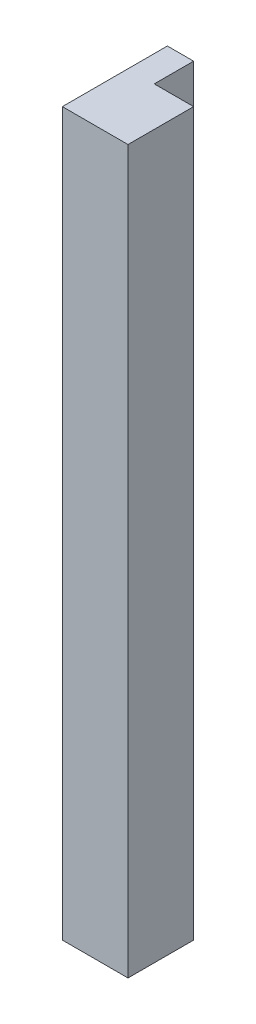
ISO-10303-21;
HEADER;
FILE_DESCRIPTION(('STEP AP214'),'2;1');
FILE_NAME('part.step','',(''),(''),'','','');
FILE_SCHEMA(('AUTOMOTIVE_DESIGN { 1 0 10303 214 1 1 1 1 }'));
ENDSEC;
DATA;
#1=APPLICATION_CONTEXT('core data for automotive mechanical design processes');
#2=APPLICATION_PROTOCOL_DEFINITION('international standard','automotive_design',2000,#1);
#3=PRODUCT_CONTEXT('',#1,'mechanical');
#4=PRODUCT('Part','Part','',(#3));
#5=PRODUCT_RELATED_PRODUCT_CATEGORY('part','',(#4));
#6=PRODUCT_DEFINITION_FORMATION('','',#4);
#7=PRODUCT_DEFINITION_CONTEXT('part definition',#1,'design');
#8=PRODUCT_DEFINITION('design','',#6,#7);
#9=PRODUCT_DEFINITION_SHAPE('','',#8);
#10=(LENGTH_UNIT() NAMED_UNIT(*) SI_UNIT(.MILLI.,.METRE.));
#11=(NAMED_UNIT(*) PLANE_ANGLE_UNIT() SI_UNIT($,.RADIAN.));
#12=(NAMED_UNIT(*) SI_UNIT($,.STERADIAN.) SOLID_ANGLE_UNIT());
#13=UNCERTAINTY_MEASURE_WITH_UNIT(LENGTH_MEASURE(1.E-05),#10,'distance_accuracy_value','');
#14=(GEOMETRIC_REPRESENTATION_CONTEXT(3) GLOBAL_UNCERTAINTY_ASSIGNED_CONTEXT((#13)) GLOBAL_UNIT_ASSIGNED_CONTEXT((#10,
#11,#12)) REPRESENTATION_CONTEXT('',''));
#15=CARTESIAN_POINT('',(0.,0.,0.));
#16=DIRECTION('',(0.,0.,1.));
#17=DIRECTION('',(1.,0.,0.));
#18=AXIS2_PLACEMENT_3D('',#15,#16,#17);
#19=CARTESIAN_POINT('',(-2.5,55.,4.));
#20=DIRECTION('',(1.,0.,0.));
#21=DIRECTION('',(0.,0.,-1.));
#22=AXIS2_PLACEMENT_3D('',#19,#20,#21);
#23=PLANE('',#22);
#24=DIRECTION('',(0.,0.,1.));
#25=VECTOR('',#24,1.);
#26=CARTESIAN_POINT('',(-2.5,0.,4.));
#27=LINE('',#26,#25);
#28=CARTESIAN_POINT('',(-2.5,0.,-4.));
#29=VERTEX_POINT('',#28);
#30=CARTESIAN_POINT('',(-2.5,0.,4.));
#31=VERTEX_POINT('',#30);
#32=EDGE_CURVE('E120',#29,#31,#27,.T.);
#33=ORIENTED_EDGE('',*,*,#32,.T.);
#34=DIRECTION('',(0.,-1.,0.));
#35=VECTOR('',#34,1.);
#36=CARTESIAN_POINT('',(-2.5,55.,4.));
#37=LINE('',#36,#35);
#38=CARTESIAN_POINT('',(-2.5,55.,4.));
#39=VERTEX_POINT('',#38);
#40=EDGE_CURVE('E11',#39,#31,#37,.T.);
#41=ORIENTED_EDGE('',*,*,#40,.F.);
#42=DIRECTION('',(0.,0.,1.));
#43=VECTOR('',#42,1.);
#44=CARTESIAN_POINT('',(-2.5,55.,4.));
#45=LINE('',#44,#43);
#46=CARTESIAN_POINT('',(-2.5,55.,-4.));
#47=VERTEX_POINT('',#46);
#48=EDGE_CURVE('E116',#47,#39,#45,.T.);
#49=ORIENTED_EDGE('',*,*,#48,.F.);
#50=DIRECTION('',(0.,-1.,0.));
#51=VECTOR('',#50,1.);
#52=CARTESIAN_POINT('',(-2.5,55.,-4.));
#53=LINE('',#52,#51);
#54=EDGE_CURVE('E114',#47,#29,#53,.T.);
#55=ORIENTED_EDGE('',*,*,#54,.T.);
#56=EDGE_LOOP('',(#33,#41,#49,#55));
#57=FACE_BOUND('',#56,.T.);
#58=ADVANCED_FACE('F34',(#57),#23,.F.);
#59=CARTESIAN_POINT('',(2.5,55.,4.));
#60=DIRECTION('',(0.,0.,-1.));
#61=DIRECTION('',(-1.,0.,0.));
#62=AXIS2_PLACEMENT_3D('',#59,#60,#61);
#63=PLANE('',#62);
#64=DIRECTION('',(1.,0.,0.));
#65=VECTOR('',#64,1.);
#66=CARTESIAN_POINT('',(2.5,0.,4.));
#67=LINE('',#66,#65);
#68=CARTESIAN_POINT('',(2.5,0.,4.));
#69=VERTEX_POINT('',#68);
#70=EDGE_CURVE('E123',#31,#69,#67,.T.);
#71=ORIENTED_EDGE('',*,*,#70,.T.);
#72=DIRECTION('',(0.,-1.,0.));
#73=VECTOR('',#72,1.);
#74=CARTESIAN_POINT('',(2.5,55.,4.));
#75=LINE('',#74,#73);
#76=CARTESIAN_POINT('',(2.5,55.,4.));
#77=VERTEX_POINT('',#76);
#78=EDGE_CURVE('E41',#77,#69,#75,.T.);
#79=ORIENTED_EDGE('',*,*,#78,.F.);
#80=DIRECTION('',(1.,0.,0.));
#81=VECTOR('',#80,1.);
#82=CARTESIAN_POINT('',(2.5,55.,4.));
#83=LINE('',#82,#81);
#84=EDGE_CURVE('E80',#39,#77,#83,.T.);
#85=ORIENTED_EDGE('',*,*,#84,.F.);
#86=ORIENTED_EDGE('',*,*,#40,.T.);
#87=EDGE_LOOP('',(#71,#79,#85,#86));
#88=FACE_BOUND('',#87,.T.);
#89=ADVANCED_FACE('F141',(#88),#63,.F.);
#90=CARTESIAN_POINT('',(2.5,55.,4.));
#91=DIRECTION('',(-1.,0.,0.));
#92=DIRECTION('',(0.,0.,1.));
#93=AXIS2_PLACEMENT_3D('',#90,#91,#92);
#94=PLANE('',#93);
#95=DIRECTION('',(0.,0.,-1.));
#96=VECTOR('',#95,1.);
#97=CARTESIAN_POINT('',(2.5,0.,4.));
#98=LINE('',#97,#96);
#99=CARTESIAN_POINT('',(2.5,0.,-1.));
#100=VERTEX_POINT('',#99);
#101=EDGE_CURVE('E110',#69,#100,#98,.T.);
#102=ORIENTED_EDGE('',*,*,#101,.T.);
#103=DIRECTION('',(0.,-1.,0.));
#104=VECTOR('',#103,1.);
#105=CARTESIAN_POINT('',(2.5,55.,-1.));
#106=LINE('',#105,#104);
#107=CARTESIAN_POINT('',(2.5,55.,-1.));
#108=VERTEX_POINT('',#107);
#109=EDGE_CURVE('E48',#108,#100,#106,.T.);
#110=ORIENTED_EDGE('',*,*,#109,.F.);
#111=DIRECTION('',(0.,0.,-1.));
#112=VECTOR('',#111,1.);
#113=CARTESIAN_POINT('',(2.5,55.,4.));
#114=LINE('',#113,#112);
#115=EDGE_CURVE('E108',#77,#108,#114,.T.);
#116=ORIENTED_EDGE('',*,*,#115,.F.);
#117=ORIENTED_EDGE('',*,*,#78,.T.);
#118=EDGE_LOOP('',(#102,#110,#116,#117));
#119=FACE_BOUND('',#118,.T.);
#120=ADVANCED_FACE('F106',(#119),#94,.F.);
#121=CARTESIAN_POINT('',(2.5,55.,-4.));
#122=DIRECTION('',(0.,0.,1.));
#123=DIRECTION('',(1.,0.,0.));
#124=AXIS2_PLACEMENT_3D('',#121,#122,#123);
#125=PLANE('',#124);
#126=DIRECTION('',(-1.,0.,0.));
#127=VECTOR('',#126,1.);
#128=CARTESIAN_POINT('',(2.5,55.,-4.));
#129=LINE('',#128,#127);
#130=CARTESIAN_POINT('',(-0.5,55.,-4.));
#131=VERTEX_POINT('',#130);
#132=EDGE_CURVE('E57',#131,#47,#129,.T.);
#133=ORIENTED_EDGE('',*,*,#132,.F.);
#134=DIRECTION('',(0.,-1.,0.));
#135=VECTOR('',#134,1.);
#136=CARTESIAN_POINT('',(-0.5,55.,-4.));
#137=LINE('',#136,#135);
#138=CARTESIAN_POINT('',(-0.5,0.,-4.));
#139=VERTEX_POINT('',#138);
#140=EDGE_CURVE('E124',#131,#139,#137,.T.);
#141=ORIENTED_EDGE('',*,*,#140,.T.);
#142=DIRECTION('',(-1.,0.,0.));
#143=VECTOR('',#142,1.);
#144=CARTESIAN_POINT('',(2.5,0.,-4.));
#145=LINE('',#144,#143);
#146=EDGE_CURVE('E75',#139,#29,#145,.T.);
#147=ORIENTED_EDGE('',*,*,#146,.T.);
#148=ORIENTED_EDGE('',*,*,#54,.F.);
#149=EDGE_LOOP('',(#133,#141,#147,#148));
#150=FACE_BOUND('',#149,.T.);
#151=ADVANCED_FACE('F147',(#150),#125,.F.);
#152=CARTESIAN_POINT('',(0.,55.,0.));
#153=DIRECTION('',(0.,1.,0.));
#154=DIRECTION('',(0.,0.,1.));
#155=AXIS2_PLACEMENT_3D('',#152,#153,#154);
#156=PLANE('',#155);
#157=DIRECTION('',(0.,0.,-1.));
#158=VECTOR('',#157,1.);
#159=CARTESIAN_POINT('',(-0.5,55.,-4.));
#160=LINE('',#159,#158);
#161=CARTESIAN_POINT('',(-0.500000000000001,55.,-1.));
#162=VERTEX_POINT('',#161);
#163=EDGE_CURVE('E100',#162,#131,#160,.T.);
#164=ORIENTED_EDGE('',*,*,#163,.T.);
#165=ORIENTED_EDGE('',*,*,#132,.T.);
#166=ORIENTED_EDGE('',*,*,#48,.T.);
#167=ORIENTED_EDGE('',*,*,#84,.T.);
#168=ORIENTED_EDGE('',*,*,#115,.T.);
#169=DIRECTION('',(-1.,0.,0.));
#170=VECTOR('',#169,1.);
#171=CARTESIAN_POINT('',(2.5,55.,-1.));
#172=LINE('',#171,#170);
#173=EDGE_CURVE('E95',#108,#162,#172,.T.);
#174=ORIENTED_EDGE('',*,*,#173,.T.);
#175=EDGE_LOOP('',(#164,#165,#166,#167,#168,#174));
#176=FACE_BOUND('',#175,.T.);
#177=ADVANCED_FACE('F112',(#176),#156,.T.);
#178=CARTESIAN_POINT('',(0.,0.,0.));
#179=DIRECTION('',(0.,1.,0.));
#180=DIRECTION('',(0.,0.,1.));
#181=AXIS2_PLACEMENT_3D('',#178,#179,#180);
#182=PLANE('',#181);
#183=ORIENTED_EDGE('',*,*,#146,.F.);
#184=DIRECTION('',(0.,0.,-1.));
#185=VECTOR('',#184,1.);
#186=CARTESIAN_POINT('',(-0.5,0.,-4.));
#187=LINE('',#186,#185);
#188=CARTESIAN_POINT('',(-0.500000000000001,0.,-1.));
#189=VERTEX_POINT('',#188);
#190=EDGE_CURVE('E101',#189,#139,#187,.T.);
#191=ORIENTED_EDGE('',*,*,#190,.F.);
#192=DIRECTION('',(-1.,0.,0.));
#193=VECTOR('',#192,1.);
#194=CARTESIAN_POINT('',(2.5,0.,-1.));
#195=LINE('',#194,#193);
#196=EDGE_CURVE('E132',#100,#189,#195,.T.);
#197=ORIENTED_EDGE('',*,*,#196,.F.);
#198=ORIENTED_EDGE('',*,*,#101,.F.);
#199=ORIENTED_EDGE('',*,*,#70,.F.);
#200=ORIENTED_EDGE('',*,*,#32,.F.);
#201=EDGE_LOOP('',(#183,#191,#197,#198,#199,#200));
#202=FACE_BOUND('',#201,.T.);
#203=ADVANCED_FACE('F129',(#202),#182,.F.);
#204=CARTESIAN_POINT('',(-0.5,55.,-4.));
#205=DIRECTION('',(-1.,0.,0.));
#206=DIRECTION('',(0.,0.,1.));
#207=AXIS2_PLACEMENT_3D('',#204,#205,#206);
#208=PLANE('',#207);
#209=ORIENTED_EDGE('',*,*,#190,.T.);
#210=ORIENTED_EDGE('',*,*,#140,.F.);
#211=ORIENTED_EDGE('',*,*,#163,.F.);
#212=DIRECTION('',(0.,-1.,0.));
#213=VECTOR('',#212,1.);
#214=CARTESIAN_POINT('',(-0.500000000000001,55.,-1.));
#215=LINE('',#214,#213);
#216=EDGE_CURVE('E97',#162,#189,#215,.T.);
#217=ORIENTED_EDGE('',*,*,#216,.T.);
#218=EDGE_LOOP('',(#209,#210,#211,#217));
#219=FACE_BOUND('',#218,.T.);
#220=ADVANCED_FACE('F154',(#219),#208,.F.);
#221=CARTESIAN_POINT('',(2.5,55.,-1.));
#222=DIRECTION('',(0.,0.,1.));
#223=DIRECTION('',(1.,0.,0.));
#224=AXIS2_PLACEMENT_3D('',#221,#222,#223);
#225=PLANE('',#224);
#226=ORIENTED_EDGE('',*,*,#196,.T.);
#227=ORIENTED_EDGE('',*,*,#216,.F.);
#228=ORIENTED_EDGE('',*,*,#173,.F.);
#229=ORIENTED_EDGE('',*,*,#109,.T.);
#230=EDGE_LOOP('',(#226,#227,#228,#229));
#231=FACE_BOUND('',#230,.T.);
#232=ADVANCED_FACE('F96',(#231),#225,.F.);
#233=CLOSED_SHELL('',(#58,#89,#120,#151,#177,#203,#220,#232));
#234=MANIFOLD_SOLID_BREP('B2',#233);
#235=ADVANCED_BREP_SHAPE_REPRESENTATION('',(#18,#234),#14);
#236=SHAPE_DEFINITION_REPRESENTATION(#9,#235);
ENDSEC;
END-ISO-10303-21;
